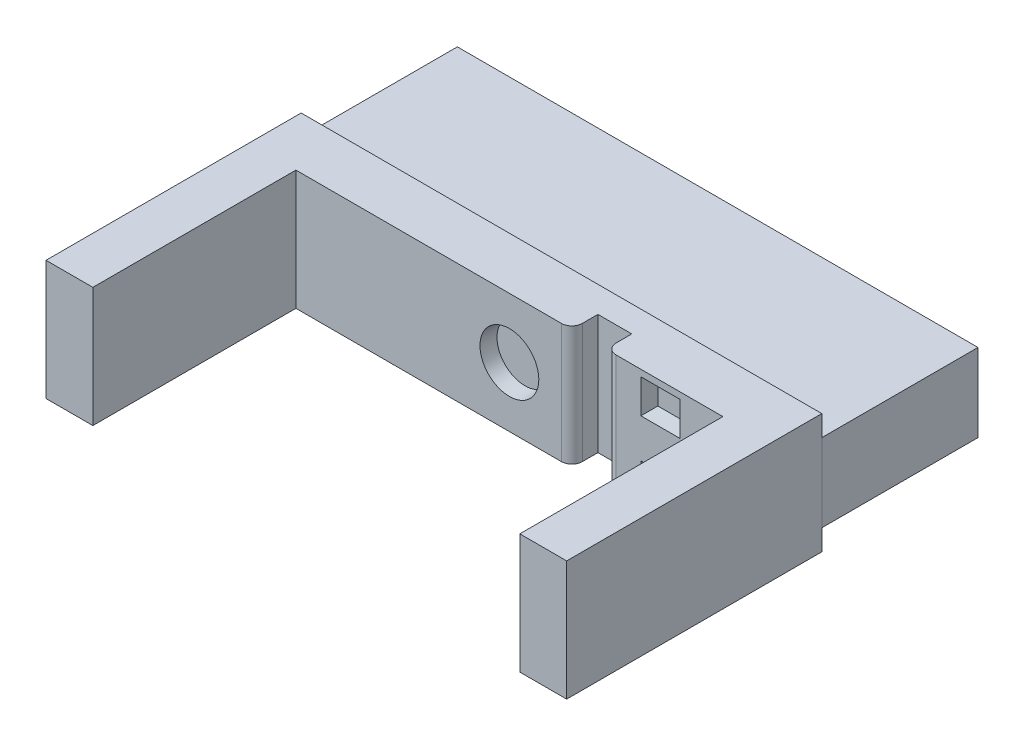
ISO-10303-21;
HEADER;
FILE_DESCRIPTION(('STEP AP214'),'2;1');
FILE_NAME('part.step','',(''),(''),'','','');
FILE_SCHEMA(('AUTOMOTIVE_DESIGN { 1 0 10303 214 1 1 1 1 }'));
ENDSEC;
DATA;
#1=APPLICATION_CONTEXT('core data for automotive mechanical design processes');
#2=APPLICATION_PROTOCOL_DEFINITION('international standard','automotive_design',2000,#1);
#3=PRODUCT_CONTEXT('',#1,'mechanical');
#4=PRODUCT('Part','Part','',(#3));
#5=PRODUCT_RELATED_PRODUCT_CATEGORY('part','',(#4));
#6=PRODUCT_DEFINITION_FORMATION('','',#4);
#7=PRODUCT_DEFINITION_CONTEXT('part definition',#1,'design');
#8=PRODUCT_DEFINITION('design','',#6,#7);
#9=PRODUCT_DEFINITION_SHAPE('','',#8);
#10=(LENGTH_UNIT() NAMED_UNIT(*) SI_UNIT(.MILLI.,.METRE.));
#11=(NAMED_UNIT(*) PLANE_ANGLE_UNIT() SI_UNIT($,.RADIAN.));
#12=(NAMED_UNIT(*) SI_UNIT($,.STERADIAN.) SOLID_ANGLE_UNIT());
#13=UNCERTAINTY_MEASURE_WITH_UNIT(LENGTH_MEASURE(1.E-05),#10,'distance_accuracy_value','');
#14=(GEOMETRIC_REPRESENTATION_CONTEXT(3) GLOBAL_UNCERTAINTY_ASSIGNED_CONTEXT((#13)) GLOBAL_UNIT_ASSIGNED_CONTEXT((#10,
#11,#12)) REPRESENTATION_CONTEXT('',''));
#15=CARTESIAN_POINT('',(0.,0.,0.));
#16=DIRECTION('',(0.,0.,1.));
#17=DIRECTION('',(1.,0.,0.));
#18=AXIS2_PLACEMENT_3D('',#15,#16,#17);
#19=CARTESIAN_POINT('',(0.,0.,40.));
#20=DIRECTION('',(0.,0.,1.));
#21=DIRECTION('',(1.,0.,0.));
#22=AXIS2_PLACEMENT_3D('',#19,#20,#21);
#23=PLANE('',#22);
#24=CARTESIAN_POINT('',(50.,-7.50000000000002,40.));
#25=DIRECTION('',(0.,0.,1.));
#26=DIRECTION('',(1.,0.,0.));
#27=AXIS2_PLACEMENT_3D('',#24,#25,#26);
#28=CIRCLE('',#27,5.64999999999999);
#29=CARTESIAN_POINT('',(55.65,-7.50000000000002,40.));
#30=VERTEX_POINT('',#29);
#31=EDGE_CURVE('E220',#30,#30,#28,.T.);
#32=ORIENTED_EDGE('',*,*,#31,.F.);
#33=EDGE_LOOP('',(#32));
#34=FACE_BOUND('',#33,.T.);
#35=DIRECTION('',(-1.,0.,0.));
#36=VECTOR('',#35,1.);
#37=CARTESIAN_POINT('',(100.,4.,40.));
#38=LINE('',#37,#36);
#39=CARTESIAN_POINT('',(60.,3.99999999999999,40.));
#40=VERTEX_POINT('',#39);
#41=CARTESIAN_POINT('',(9.00000000000001,3.99999999999999,40.));
#42=VERTEX_POINT('',#41);
#43=EDGE_CURVE('E331',#40,#42,#38,.T.);
#44=ORIENTED_EDGE('',*,*,#43,.T.);
#45=DIRECTION('',(0.,1.,0.));
#46=VECTOR('',#45,1.);
#47=CARTESIAN_POINT('',(9.,-19.,40.));
#48=LINE('',#47,#46);
#49=CARTESIAN_POINT('',(9.00000000000001,-19.,40.));
#50=VERTEX_POINT('',#49);
#51=EDGE_CURVE('E263',#50,#42,#48,.T.);
#52=ORIENTED_EDGE('',*,*,#51,.F.);
#53=DIRECTION('',(1.,0.,0.));
#54=VECTOR('',#53,1.);
#55=CARTESIAN_POINT('',(100.,-19.,40.));
#56=LINE('',#55,#54);
#57=CARTESIAN_POINT('',(60.,-19.,40.));
#58=VERTEX_POINT('',#57);
#59=EDGE_CURVE('E332',#50,#58,#56,.T.);
#60=ORIENTED_EDGE('',*,*,#59,.T.);
#61=DIRECTION('',(0.,-1.,0.));
#62=VECTOR('',#61,1.);
#63=CARTESIAN_POINT('',(60.,3.99999999999999,40.));
#64=LINE('',#63,#62);
#65=EDGE_CURVE('E362',#58,#40,#64,.F.);
#66=ORIENTED_EDGE('',*,*,#65,.T.);
#67=EDGE_LOOP('',(#44,#52,#60,#66));
#68=FACE_BOUND('',#67,.T.);
#69=ADVANCED_FACE('F42',(#34,#68),#23,.T.);
#70=DIRECTION('',(0.,-1.,0.));
#71=VECTOR('',#70,1.);
#72=CARTESIAN_POINT('',(75.25,-17.75,40.));
#73=LINE('',#72,#71);
#74=CARTESIAN_POINT('',(75.25,-11.25,40.));
#75=VERTEX_POINT('',#74);
#76=CARTESIAN_POINT('',(75.25,-17.75,40.));
#77=VERTEX_POINT('',#76);
#78=EDGE_CURVE('E57',#75,#77,#73,.T.);
#79=ORIENTED_EDGE('',*,*,#78,.F.);
#80=DIRECTION('',(-1.,0.,0.));
#81=VECTOR('',#80,1.);
#82=CARTESIAN_POINT('',(75.25,-11.25,40.));
#83=LINE('',#82,#81);
#84=CARTESIAN_POINT('',(82.75,-11.25,40.));
#85=VERTEX_POINT('',#84);
#86=EDGE_CURVE('E212',#85,#75,#83,.T.);
#87=ORIENTED_EDGE('',*,*,#86,.F.);
#88=DIRECTION('',(0.,1.,0.));
#89=VECTOR('',#88,1.);
#90=CARTESIAN_POINT('',(82.75,-17.75,40.));
#91=LINE('',#90,#89);
#92=CARTESIAN_POINT('',(82.75,-17.75,40.));
#93=VERTEX_POINT('',#92);
#94=EDGE_CURVE('E194',#93,#85,#91,.T.);
#95=ORIENTED_EDGE('',*,*,#94,.F.);
#96=DIRECTION('',(1.,0.,0.));
#97=VECTOR('',#96,1.);
#98=CARTESIAN_POINT('',(75.25,-17.75,40.));
#99=LINE('',#98,#97);
#100=EDGE_CURVE('E205',#77,#93,#99,.T.);
#101=ORIENTED_EDGE('',*,*,#100,.F.);
#102=EDGE_LOOP('',(#79,#87,#95,#101));
#103=FACE_BOUND('',#102,.T.);
#104=DIRECTION('',(0.,-1.,0.));
#105=VECTOR('',#104,1.);
#106=CARTESIAN_POINT('',(75.25,-3.75,40.));
#107=LINE('',#106,#105);
#108=CARTESIAN_POINT('',(75.25,2.75,40.));
#109=VERTEX_POINT('',#108);
#110=CARTESIAN_POINT('',(75.25,-3.75,40.));
#111=VERTEX_POINT('',#110);
#112=EDGE_CURVE('E65',#109,#111,#107,.T.);
#113=ORIENTED_EDGE('',*,*,#112,.F.);
#114=DIRECTION('',(-1.,0.,0.));
#115=VECTOR('',#114,1.);
#116=CARTESIAN_POINT('',(75.25,2.75,40.));
#117=LINE('',#116,#115);
#118=CARTESIAN_POINT('',(82.75,2.75,40.));
#119=VERTEX_POINT('',#118);
#120=EDGE_CURVE('E239',#119,#109,#117,.T.);
#121=ORIENTED_EDGE('',*,*,#120,.F.);
#122=DIRECTION('',(0.,1.,0.));
#123=VECTOR('',#122,1.);
#124=CARTESIAN_POINT('',(82.75,-3.75,40.));
#125=LINE('',#124,#123);
#126=CARTESIAN_POINT('',(82.75,-3.75,40.));
#127=VERTEX_POINT('',#126);
#128=EDGE_CURVE('E236',#127,#119,#125,.T.);
#129=ORIENTED_EDGE('',*,*,#128,.F.);
#130=DIRECTION('',(1.,0.,0.));
#131=VECTOR('',#130,1.);
#132=CARTESIAN_POINT('',(75.25,-3.75,40.));
#133=LINE('',#132,#131);
#134=EDGE_CURVE('E232',#111,#127,#133,.T.);
#135=ORIENTED_EDGE('',*,*,#134,.F.);
#136=EDGE_LOOP('',(#113,#121,#129,#135));
#137=FACE_BOUND('',#136,.T.);
#138=CARTESIAN_POINT('',(70.5,-19.,40.));
#139=VERTEX_POINT('',#138);
#140=CARTESIAN_POINT('',(91.,-19.,40.));
#141=VERTEX_POINT('',#140);
#142=EDGE_CURVE('E330',#139,#141,#56,.T.);
#143=ORIENTED_EDGE('',*,*,#142,.T.);
#144=DIRECTION('',(0.,-1.,0.));
#145=VECTOR('',#144,1.);
#146=CARTESIAN_POINT('',(91.,-19.,40.));
#147=LINE('',#146,#145);
#148=CARTESIAN_POINT('',(91.,4.,40.));
#149=VERTEX_POINT('',#148);
#150=EDGE_CURVE('E284',#149,#141,#147,.T.);
#151=ORIENTED_EDGE('',*,*,#150,.F.);
#152=CARTESIAN_POINT('',(70.5,3.99999999999999,40.));
#153=VERTEX_POINT('',#152);
#154=EDGE_CURVE('E328',#149,#153,#38,.T.);
#155=ORIENTED_EDGE('',*,*,#154,.T.);
#156=DIRECTION('',(0.,-1.,0.));
#157=VECTOR('',#156,1.);
#158=CARTESIAN_POINT('',(70.5,0.,40.));
#159=LINE('',#158,#157);
#160=EDGE_CURVE('E50',#153,#139,#159,.T.);
#161=ORIENTED_EDGE('',*,*,#160,.T.);
#162=EDGE_LOOP('',(#143,#151,#155,#161));
#163=FACE_BOUND('',#162,.T.);
#164=ADVANCED_FACE('F209',(#103,#137,#163),#23,.T.);
#165=CARTESIAN_POINT('',(100.,4.,40.));
#166=DIRECTION('',(0.,-1.,0.));
#167=DIRECTION('',(1.,0.,0.));
#168=AXIS2_PLACEMENT_3D('',#165,#166,#167);
#169=PLANE('',#168);
#170=ORIENTED_EDGE('',*,*,#43,.F.);
#171=CARTESIAN_POINT('',(60.,3.99999999999999,38.));
#172=DIRECTION('',(0.,-1.,0.));
#173=DIRECTION('',(1.,0.,0.));
#174=AXIS2_PLACEMENT_3D('',#171,#172,#173);
#175=CIRCLE('',#174,2.);
#176=CARTESIAN_POINT('',(62.,3.99999999999999,38.));
#177=VERTEX_POINT('',#176);
#178=EDGE_CURVE('E367',#40,#177,#175,.F.);
#179=ORIENTED_EDGE('',*,*,#178,.T.);
#180=DIRECTION('',(0.,0.,1.));
#181=VECTOR('',#180,1.);
#182=CARTESIAN_POINT('',(62.,3.99999999999999,35.));
#183=LINE('',#182,#181);
#184=CARTESIAN_POINT('',(62.,3.99999999999999,35.));
#185=VERTEX_POINT('',#184);
#186=EDGE_CURVE('E323',#185,#177,#183,.T.);
#187=ORIENTED_EDGE('',*,*,#186,.F.);
#188=DIRECTION('',(-1.,0.,0.));
#189=VECTOR('',#188,1.);
#190=CARTESIAN_POINT('',(0.,3.99999999999999,35.));
#191=LINE('',#190,#189);
#192=CARTESIAN_POINT('',(68.5,3.99999999999999,35.));
#193=VERTEX_POINT('',#192);
#194=EDGE_CURVE('E306',#193,#185,#191,.T.);
#195=ORIENTED_EDGE('',*,*,#194,.F.);
#196=DIRECTION('',(0.,0.,1.));
#197=VECTOR('',#196,1.);
#198=CARTESIAN_POINT('',(68.5,3.99999999999999,35.));
#199=LINE('',#198,#197);
#200=CARTESIAN_POINT('',(68.5,3.99999999999999,38.));
#201=VERTEX_POINT('',#200);
#202=EDGE_CURVE('E315',#193,#201,#199,.T.);
#203=ORIENTED_EDGE('',*,*,#202,.T.);
#204=CARTESIAN_POINT('',(70.5,3.99999999999999,38.));
#205=DIRECTION('',(0.,-1.,0.));
#206=DIRECTION('',(1.,0.,0.));
#207=AXIS2_PLACEMENT_3D('',#204,#205,#206);
#208=CIRCLE('',#207,2.);
#209=EDGE_CURVE('E364',#201,#153,#208,.F.);
#210=ORIENTED_EDGE('',*,*,#209,.T.);
#211=ORIENTED_EDGE('',*,*,#154,.F.);
#212=DIRECTION('',(0.,0.,-1.));
#213=VECTOR('',#212,1.);
#214=CARTESIAN_POINT('',(91.,4.,106.698178070457));
#215=LINE('',#214,#213);
#216=CARTESIAN_POINT('',(91.,4.,79.));
#217=VERTEX_POINT('',#216);
#218=EDGE_CURVE('E270',#217,#149,#215,.T.);
#219=ORIENTED_EDGE('',*,*,#218,.F.);
#220=DIRECTION('',(-1.,0.,0.));
#221=VECTOR('',#220,1.);
#222=CARTESIAN_POINT('',(100.,4.,79.));
#223=LINE('',#222,#221);
#224=CARTESIAN_POINT('',(100.,4.,79.));
#225=VERTEX_POINT('',#224);
#226=EDGE_CURVE('E292',#225,#217,#223,.T.);
#227=ORIENTED_EDGE('',*,*,#226,.F.);
#228=DIRECTION('',(0.,0.,-1.));
#229=VECTOR('',#228,1.);
#230=CARTESIAN_POINT('',(100.,4.,40.));
#231=LINE('',#230,#229);
#232=CARTESIAN_POINT('',(100.,4.,30.));
#233=VERTEX_POINT('',#232);
#234=EDGE_CURVE('E351',#225,#233,#231,.T.);
#235=ORIENTED_EDGE('',*,*,#234,.T.);
#236=DIRECTION('',(-1.,0.,0.));
#237=VECTOR('',#236,1.);
#238=CARTESIAN_POINT('',(100.,4.,30.));
#239=LINE('',#238,#237);
#240=CARTESIAN_POINT('',(0.,3.99999999999999,30.));
#241=VERTEX_POINT('',#240);
#242=EDGE_CURVE('E337',#233,#241,#239,.T.);
#243=ORIENTED_EDGE('',*,*,#242,.T.);
#244=DIRECTION('',(0.,0.,-1.));
#245=VECTOR('',#244,1.);
#246=CARTESIAN_POINT('',(0.,3.99999999999999,40.));
#247=LINE('',#246,#245);
#248=CARTESIAN_POINT('',(0.,3.99999999999999,79.));
#249=VERTEX_POINT('',#248);
#250=EDGE_CURVE('E348',#249,#241,#247,.T.);
#251=ORIENTED_EDGE('',*,*,#250,.F.);
#252=DIRECTION('',(-1.,0.,0.));
#253=VECTOR('',#252,1.);
#254=CARTESIAN_POINT('',(0.,3.99999999999999,79.));
#255=LINE('',#254,#253);
#256=CARTESIAN_POINT('',(9.,3.99999999999999,79.));
#257=VERTEX_POINT('',#256);
#258=EDGE_CURVE('E277',#257,#249,#255,.T.);
#259=ORIENTED_EDGE('',*,*,#258,.F.);
#260=DIRECTION('',(0.,0.,-1.));
#261=VECTOR('',#260,1.);
#262=CARTESIAN_POINT('',(9.,3.99999999999999,106.698178070457));
#263=LINE('',#262,#261);
#264=EDGE_CURVE('E266',#257,#42,#263,.T.);
#265=ORIENTED_EDGE('',*,*,#264,.T.);
#266=EDGE_LOOP('',(#170,#179,#187,#195,#203,#210,#211,#219,#227,#235,#243,#251,#259,#265));
#267=FACE_BOUND('',#266,.T.);
#268=ADVANCED_FACE('F384',(#267),#169,.F.);
#269=CARTESIAN_POINT('',(100.,-19.,40.));
#270=DIRECTION('',(0.,1.,0.));
#271=DIRECTION('',(-1.,0.,0.));
#272=AXIS2_PLACEMENT_3D('',#269,#270,#271);
#273=PLANE('',#272);
#274=DIRECTION('',(0.,0.,1.));
#275=VECTOR('',#274,1.);
#276=CARTESIAN_POINT('',(62.,-19.,35.));
#277=LINE('',#276,#275);
#278=CARTESIAN_POINT('',(62.,-19.,35.));
#279=VERTEX_POINT('',#278);
#280=CARTESIAN_POINT('',(62.,-19.,38.));
#281=VERTEX_POINT('',#280);
#282=EDGE_CURVE('E320',#279,#281,#277,.T.);
#283=ORIENTED_EDGE('',*,*,#282,.T.);
#284=CARTESIAN_POINT('',(60.,-19.,38.));
#285=DIRECTION('',(0.,1.,0.));
#286=DIRECTION('',(-1.,0.,0.));
#287=AXIS2_PLACEMENT_3D('',#284,#285,#286);
#288=CIRCLE('',#287,2.);
#289=EDGE_CURVE('E359',#281,#58,#288,.F.);
#290=ORIENTED_EDGE('',*,*,#289,.T.);
#291=ORIENTED_EDGE('',*,*,#59,.F.);
#292=DIRECTION('',(0.,0.,-1.));
#293=VECTOR('',#292,1.);
#294=CARTESIAN_POINT('',(9.,-19.,106.698178070457));
#295=LINE('',#294,#293);
#296=CARTESIAN_POINT('',(9.,-19.,79.));
#297=VERTEX_POINT('',#296);
#298=EDGE_CURVE('E245',#297,#50,#295,.T.);
#299=ORIENTED_EDGE('',*,*,#298,.F.);
#300=DIRECTION('',(1.,0.,0.));
#301=VECTOR('',#300,1.);
#302=CARTESIAN_POINT('',(0.,-19.,79.));
#303=LINE('',#302,#301);
#304=CARTESIAN_POINT('',(0.,-19.,79.));
#305=VERTEX_POINT('',#304);
#306=EDGE_CURVE('E271',#305,#297,#303,.T.);
#307=ORIENTED_EDGE('',*,*,#306,.F.);
#308=DIRECTION('',(0.,0.,-1.));
#309=VECTOR('',#308,1.);
#310=CARTESIAN_POINT('',(0.,-19.,40.));
#311=LINE('',#310,#309);
#312=CARTESIAN_POINT('',(0.,-19.,30.));
#313=VERTEX_POINT('',#312);
#314=EDGE_CURVE('E345',#305,#313,#311,.T.);
#315=ORIENTED_EDGE('',*,*,#314,.T.);
#316=DIRECTION('',(1.,0.,0.));
#317=VECTOR('',#316,1.);
#318=CARTESIAN_POINT('',(100.,-19.,30.));
#319=LINE('',#318,#317);
#320=CARTESIAN_POINT('',(100.,-19.,30.));
#321=VERTEX_POINT('',#320);
#322=EDGE_CURVE('E341',#313,#321,#319,.T.);
#323=ORIENTED_EDGE('',*,*,#322,.T.);
#324=DIRECTION('',(0.,0.,-1.));
#325=VECTOR('',#324,1.);
#326=CARTESIAN_POINT('',(100.,-19.,40.));
#327=LINE('',#326,#325);
#328=CARTESIAN_POINT('',(100.,-19.,79.));
#329=VERTEX_POINT('',#328);
#330=EDGE_CURVE('E334',#329,#321,#327,.T.);
#331=ORIENTED_EDGE('',*,*,#330,.F.);
#332=DIRECTION('',(1.,0.,0.));
#333=VECTOR('',#332,1.);
#334=CARTESIAN_POINT('',(100.,-19.,79.));
#335=LINE('',#334,#333);
#336=CARTESIAN_POINT('',(91.,-19.,79.));
#337=VERTEX_POINT('',#336);
#338=EDGE_CURVE('E298',#337,#329,#335,.T.);
#339=ORIENTED_EDGE('',*,*,#338,.F.);
#340=DIRECTION('',(0.,0.,-1.));
#341=VECTOR('',#340,1.);
#342=CARTESIAN_POINT('',(91.,-19.,106.698178070457));
#343=LINE('',#342,#341);
#344=EDGE_CURVE('E287',#337,#141,#343,.T.);
#345=ORIENTED_EDGE('',*,*,#344,.T.);
#346=ORIENTED_EDGE('',*,*,#142,.F.);
#347=CARTESIAN_POINT('',(70.5,-19.,38.));
#348=DIRECTION('',(0.,1.,0.));
#349=DIRECTION('',(-1.,0.,0.));
#350=AXIS2_PLACEMENT_3D('',#347,#348,#349);
#351=CIRCLE('',#350,2.);
#352=CARTESIAN_POINT('',(68.5,-19.,38.));
#353=VERTEX_POINT('',#352);
#354=EDGE_CURVE('E357',#139,#353,#351,.F.);
#355=ORIENTED_EDGE('',*,*,#354,.T.);
#356=DIRECTION('',(0.,0.,1.));
#357=VECTOR('',#356,1.);
#358=CARTESIAN_POINT('',(68.5,-19.,35.));
#359=LINE('',#358,#357);
#360=CARTESIAN_POINT('',(68.5,-19.,35.));
#361=VERTEX_POINT('',#360);
#362=EDGE_CURVE('E316',#361,#353,#359,.T.);
#363=ORIENTED_EDGE('',*,*,#362,.F.);
#364=DIRECTION('',(1.,0.,0.));
#365=VECTOR('',#364,1.);
#366=CARTESIAN_POINT('',(0.,-19.,35.));
#367=LINE('',#366,#365);
#368=EDGE_CURVE('E312',#279,#361,#367,.T.);
#369=ORIENTED_EDGE('',*,*,#368,.F.);
#370=EDGE_LOOP('',(#283,#290,#291,#299,#307,#315,#323,#331,#339,#345,#346,#355,#363,#369));
#371=FACE_BOUND('',#370,.T.);
#372=ADVANCED_FACE('F376',(#371),#273,.F.);
#373=CARTESIAN_POINT('',(100.,-19.,40.));
#374=DIRECTION('',(-1.,0.,0.));
#375=DIRECTION('',(0.,0.,1.));
#376=AXIS2_PLACEMENT_3D('',#373,#374,#375);
#377=PLANE('',#376);
#378=DIRECTION('',(0.,1.,0.));
#379=VECTOR('',#378,1.);
#380=CARTESIAN_POINT('',(100.,-19.,30.));
#381=LINE('',#380,#379);
#382=EDGE_CURVE('E319',#321,#233,#381,.T.);
#383=ORIENTED_EDGE('',*,*,#382,.T.);
#384=ORIENTED_EDGE('',*,*,#234,.F.);
#385=DIRECTION('',(0.,1.,0.));
#386=VECTOR('',#385,1.);
#387=CARTESIAN_POINT('',(100.,-19.,79.));
#388=LINE('',#387,#386);
#389=EDGE_CURVE('E295',#329,#225,#388,.T.);
#390=ORIENTED_EDGE('',*,*,#389,.F.);
#391=ORIENTED_EDGE('',*,*,#330,.T.);
#392=EDGE_LOOP('',(#383,#384,#390,#391));
#393=FACE_BOUND('',#392,.T.);
#394=ADVANCED_FACE('F419',(#393),#377,.F.);
#395=CARTESIAN_POINT('',(0.,-19.,40.));
#396=DIRECTION('',(1.,0.,0.));
#397=DIRECTION('',(0.,1.,0.));
#398=AXIS2_PLACEMENT_3D('',#395,#396,#397);
#399=PLANE('',#398);
#400=DIRECTION('',(0.,-1.,0.));
#401=VECTOR('',#400,1.);
#402=CARTESIAN_POINT('',(0.,-19.,30.));
#403=LINE('',#402,#401);
#404=EDGE_CURVE('E339',#241,#313,#403,.T.);
#405=ORIENTED_EDGE('',*,*,#404,.T.);
#406=ORIENTED_EDGE('',*,*,#314,.F.);
#407=DIRECTION('',(0.,-1.,0.));
#408=VECTOR('',#407,1.);
#409=CARTESIAN_POINT('',(0.,-19.,79.));
#410=LINE('',#409,#408);
#411=EDGE_CURVE('E274',#249,#305,#410,.T.);
#412=ORIENTED_EDGE('',*,*,#411,.F.);
#413=ORIENTED_EDGE('',*,*,#250,.T.);
#414=EDGE_LOOP('',(#405,#406,#412,#413));
#415=FACE_BOUND('',#414,.T.);
#416=ADVANCED_FACE('F423',(#415),#399,.F.);
#417=CARTESIAN_POINT('',(0.,0.,30.));
#418=DIRECTION('',(0.,0.,1.));
#419=DIRECTION('',(1.,0.,0.));
#420=AXIS2_PLACEMENT_3D('',#417,#418,#419);
#421=PLANE('',#420);
#422=ORIENTED_EDGE('',*,*,#382,.F.);
#423=ORIENTED_EDGE('',*,*,#322,.F.);
#424=ORIENTED_EDGE('',*,*,#404,.F.);
#425=ORIENTED_EDGE('',*,*,#242,.F.);
#426=EDGE_LOOP('',(#422,#423,#424,#425));
#427=FACE_BOUND('',#426,.T.);
#428=ADVANCED_FACE('F417',(#427),#421,.F.);
#429=CARTESIAN_POINT('',(68.5,0.,35.));
#430=DIRECTION('',(-1.,0.,0.));
#431=DIRECTION('',(0.,-1.,0.));
#432=AXIS2_PLACEMENT_3D('',#429,#430,#431);
#433=PLANE('',#432);
#434=ORIENTED_EDGE('',*,*,#362,.T.);
#435=DIRECTION('',(0.,-1.,0.));
#436=VECTOR('',#435,1.);
#437=CARTESIAN_POINT('',(68.5,0.,38.));
#438=LINE('',#437,#436);
#439=EDGE_CURVE('E12',#353,#201,#438,.F.);
#440=ORIENTED_EDGE('',*,*,#439,.T.);
#441=ORIENTED_EDGE('',*,*,#202,.F.);
#442=DIRECTION('',(0.,-1.,0.));
#443=VECTOR('',#442,1.);
#444=CARTESIAN_POINT('',(68.5,0.,35.));
#445=LINE('',#444,#443);
#446=EDGE_CURVE('E291',#193,#361,#445,.T.);
#447=ORIENTED_EDGE('',*,*,#446,.T.);
#448=EDGE_LOOP('',(#434,#440,#441,#447));
#449=FACE_BOUND('',#448,.T.);
#450=ADVANCED_FACE('F389',(#449),#433,.T.);
#451=CARTESIAN_POINT('',(62.,0.,35.));
#452=DIRECTION('',(-1.,0.,0.));
#453=DIRECTION('',(0.,0.,1.));
#454=AXIS2_PLACEMENT_3D('',#451,#452,#453);
#455=PLANE('',#454);
#456=ORIENTED_EDGE('',*,*,#186,.T.);
#457=DIRECTION('',(0.,-1.,0.));
#458=VECTOR('',#457,1.);
#459=CARTESIAN_POINT('',(62.,-19.,38.));
#460=LINE('',#459,#458);
#461=EDGE_CURVE('E354',#177,#281,#460,.T.);
#462=ORIENTED_EDGE('',*,*,#461,.T.);
#463=ORIENTED_EDGE('',*,*,#282,.F.);
#464=DIRECTION('',(0.,-1.,0.));
#465=VECTOR('',#464,1.);
#466=CARTESIAN_POINT('',(62.,0.,35.));
#467=LINE('',#466,#465);
#468=EDGE_CURVE('E309',#185,#279,#467,.T.);
#469=ORIENTED_EDGE('',*,*,#468,.F.);
#470=EDGE_LOOP('',(#456,#462,#463,#469));
#471=FACE_BOUND('',#470,.T.);
#472=ADVANCED_FACE('F396',(#471),#455,.F.);
#473=CARTESIAN_POINT('',(0.,0.,35.));
#474=DIRECTION('',(0.,0.,1.));
#475=DIRECTION('',(1.,0.,0.));
#476=AXIS2_PLACEMENT_3D('',#473,#474,#475);
#477=PLANE('',#476);
#478=ORIENTED_EDGE('',*,*,#446,.F.);
#479=ORIENTED_EDGE('',*,*,#194,.T.);
#480=ORIENTED_EDGE('',*,*,#468,.T.);
#481=ORIENTED_EDGE('',*,*,#368,.T.);
#482=EDGE_LOOP('',(#478,#479,#480,#481));
#483=FACE_BOUND('',#482,.T.);
#484=ADVANCED_FACE('F393',(#483),#477,.T.);
#485=CARTESIAN_POINT('',(60.,0.,38.));
#486=DIRECTION('',(0.,1.,0.));
#487=DIRECTION('',(0.,0.,1.));
#488=AXIS2_PLACEMENT_3D('',#485,#486,#487);
#489=CYLINDRICAL_SURFACE('',#488,2.);
#490=ORIENTED_EDGE('',*,*,#178,.F.);
#491=ORIENTED_EDGE('',*,*,#65,.F.);
#492=ORIENTED_EDGE('',*,*,#289,.F.);
#493=ORIENTED_EDGE('',*,*,#461,.F.);
#494=EDGE_LOOP('',(#490,#491,#492,#493));
#495=FACE_BOUND('',#494,.T.);
#496=ADVANCED_FACE('F400',(#495),#489,.T.);
#497=CARTESIAN_POINT('',(70.5,0.,38.));
#498=DIRECTION('',(0.,-1.,0.));
#499=DIRECTION('',(1.,0.,0.));
#500=AXIS2_PLACEMENT_3D('',#497,#498,#499);
#501=CYLINDRICAL_SURFACE('',#500,2.);
#502=ORIENTED_EDGE('',*,*,#209,.F.);
#503=ORIENTED_EDGE('',*,*,#439,.F.);
#504=ORIENTED_EDGE('',*,*,#354,.F.);
#505=ORIENTED_EDGE('',*,*,#160,.F.);
#506=EDGE_LOOP('',(#502,#503,#504,#505));
#507=FACE_BOUND('',#506,.T.);
#508=ADVANCED_FACE('F44',(#507),#501,.T.);
#509=CARTESIAN_POINT('',(91.,-19.,106.698178070457));
#510=DIRECTION('',(1.,0.,0.));
#511=DIRECTION('',(0.,0.,-1.));
#512=AXIS2_PLACEMENT_3D('',#509,#510,#511);
#513=PLANE('',#512);
#514=DIRECTION('',(0.,-1.,0.));
#515=VECTOR('',#514,1.);
#516=CARTESIAN_POINT('',(91.,-19.,79.));
#517=LINE('',#516,#515);
#518=EDGE_CURVE('E288',#217,#337,#517,.T.);
#519=ORIENTED_EDGE('',*,*,#518,.F.);
#520=ORIENTED_EDGE('',*,*,#218,.T.);
#521=ORIENTED_EDGE('',*,*,#150,.T.);
#522=ORIENTED_EDGE('',*,*,#344,.F.);
#523=EDGE_LOOP('',(#519,#520,#521,#522));
#524=FACE_BOUND('',#523,.T.);
#525=ADVANCED_FACE('F380',(#524),#513,.F.);
#526=CARTESIAN_POINT('',(49.9999999999998,-7.49999999999999,79.));
#527=DIRECTION('',(0.,0.,1.));
#528=DIRECTION('',(-0.166841632601668,-0.985983706574713,0.));
#529=AXIS2_PLACEMENT_3D('',#526,#527,#528);
#530=PLANE('',#529);
#531=ORIENTED_EDGE('',*,*,#338,.T.);
#532=ORIENTED_EDGE('',*,*,#389,.T.);
#533=ORIENTED_EDGE('',*,*,#226,.T.);
#534=ORIENTED_EDGE('',*,*,#518,.T.);
#535=EDGE_LOOP('',(#531,#532,#533,#534));
#536=FACE_BOUND('',#535,.T.);
#537=ADVANCED_FACE('F422',(#536),#530,.T.);
#538=CARTESIAN_POINT('',(9.,-19.,106.698178070457));
#539=DIRECTION('',(-1.,0.,0.));
#540=DIRECTION('',(0.,-1.,0.));
#541=AXIS2_PLACEMENT_3D('',#538,#539,#540);
#542=PLANE('',#541);
#543=DIRECTION('',(0.,1.,0.));
#544=VECTOR('',#543,1.);
#545=CARTESIAN_POINT('',(9.,-19.,79.));
#546=LINE('',#545,#544);
#547=EDGE_CURVE('E267',#297,#257,#546,.T.);
#548=ORIENTED_EDGE('',*,*,#547,.F.);
#549=ORIENTED_EDGE('',*,*,#298,.T.);
#550=ORIENTED_EDGE('',*,*,#51,.T.);
#551=ORIENTED_EDGE('',*,*,#264,.F.);
#552=EDGE_LOOP('',(#548,#549,#550,#551));
#553=FACE_BOUND('',#552,.T.);
#554=ADVANCED_FACE('F407',(#553),#542,.F.);
#555=CARTESIAN_POINT('',(49.9999999999998,-7.49999999999999,79.));
#556=DIRECTION('',(0.,0.,1.));
#557=DIRECTION('',(-0.166841632601668,-0.985983706574713,0.));
#558=AXIS2_PLACEMENT_3D('',#555,#556,#557);
#559=PLANE('',#558);
#560=ORIENTED_EDGE('',*,*,#258,.T.);
#561=ORIENTED_EDGE('',*,*,#411,.T.);
#562=ORIENTED_EDGE('',*,*,#306,.T.);
#563=ORIENTED_EDGE('',*,*,#547,.T.);
#564=EDGE_LOOP('',(#560,#561,#562,#563));
#565=FACE_BOUND('',#564,.T.);
#566=ADVANCED_FACE('F410',(#565),#559,.T.);
#567=CARTESIAN_POINT('',(75.25,-3.75,40.));
#568=DIRECTION('',(-0.996194698091746,0.,-0.0871557427476582));
#569=DIRECTION('',(-0.0871557427476582,0.,0.996194698091746));
#570=AXIS2_PLACEMENT_3D('',#567,#568,#569);
#571=PLANE('',#570);
#572=ORIENTED_EDGE('',*,*,#112,.T.);
#573=DIRECTION('',(-0.0868265938642476,-0.0868265938642476,0.992432509138967));
#574=VECTOR('',#573,1.);
#575=CARTESIAN_POINT('',(75.25,-3.75,40.));
#576=LINE('',#575,#574);
#577=CARTESIAN_POINT('',(75.5124659905778,-3.48753400942223,37.));
#578=VERTEX_POINT('',#577);
#579=EDGE_CURVE('E247',#578,#111,#576,.T.);
#580=ORIENTED_EDGE('',*,*,#579,.F.);
#581=DIRECTION('',(0.,-1.,0.));
#582=VECTOR('',#581,1.);
#583=CARTESIAN_POINT('',(75.5124659905778,-3.75,37.));
#584=LINE('',#583,#582);
#585=CARTESIAN_POINT('',(75.5124659905778,2.48753400942223,37.));
#586=VERTEX_POINT('',#585);
#587=EDGE_CURVE('E242',#586,#578,#584,.T.);
#588=ORIENTED_EDGE('',*,*,#587,.F.);
#589=DIRECTION('',(-0.0868265938642476,0.0868265938642476,0.992432509138967));
#590=VECTOR('',#589,1.);
#591=CARTESIAN_POINT('',(75.25,2.75,40.));
#592=LINE('',#591,#590);
#593=EDGE_CURVE('E243',#586,#109,#592,.T.);
#594=ORIENTED_EDGE('',*,*,#593,.T.);
#595=EDGE_LOOP('',(#572,#580,#588,#594));
#596=FACE_BOUND('',#595,.T.);
#597=ADVANCED_FACE('F465',(#596),#571,.F.);
#598=CARTESIAN_POINT('',(75.25,2.75,40.));
#599=DIRECTION('',(0.,0.996194698091746,-0.0871557427476582));
#600=DIRECTION('',(0.,0.0871557427476582,0.996194698091746));
#601=AXIS2_PLACEMENT_3D('',#598,#599,#600);
#602=PLANE('',#601);
#603=ORIENTED_EDGE('',*,*,#120,.T.);
#604=ORIENTED_EDGE('',*,*,#593,.F.);
#605=DIRECTION('',(-1.,0.,0.));
#606=VECTOR('',#605,1.);
#607=CARTESIAN_POINT('',(75.25,2.48753400942223,37.));
#608=LINE('',#607,#606);
#609=CARTESIAN_POINT('',(82.4875340094222,2.48753400942223,37.));
#610=VERTEX_POINT('',#609);
#611=EDGE_CURVE('E250',#610,#586,#608,.T.);
#612=ORIENTED_EDGE('',*,*,#611,.F.);
#613=DIRECTION('',(0.0868265938642476,0.0868265938642476,0.992432509138967));
#614=VECTOR('',#613,1.);
#615=CARTESIAN_POINT('',(82.7009974268866,2.70099742688657,39.4398980263435));
#616=LINE('',#615,#614);
#617=EDGE_CURVE('E246',#610,#119,#616,.T.);
#618=ORIENTED_EDGE('',*,*,#617,.T.);
#619=EDGE_LOOP('',(#603,#604,#612,#618));
#620=FACE_BOUND('',#619,.T.);
#621=ADVANCED_FACE('F468',(#620),#602,.F.);
#622=CARTESIAN_POINT('',(82.75,-3.75,40.));
#623=DIRECTION('',(0.996194698091746,0.,-0.0871557427476582));
#624=DIRECTION('',(-0.0871557427476582,0.,-0.996194698091746));
#625=AXIS2_PLACEMENT_3D('',#622,#623,#624);
#626=PLANE('',#625);
#627=ORIENTED_EDGE('',*,*,#128,.T.);
#628=ORIENTED_EDGE('',*,*,#617,.F.);
#629=DIRECTION('',(0.,1.,0.));
#630=VECTOR('',#629,1.);
#631=CARTESIAN_POINT('',(82.4875340094222,-3.75,37.));
#632=LINE('',#631,#630);
#633=CARTESIAN_POINT('',(82.4875340094222,-3.48753400942223,37.));
#634=VERTEX_POINT('',#633);
#635=EDGE_CURVE('E258',#634,#610,#632,.T.);
#636=ORIENTED_EDGE('',*,*,#635,.F.);
#637=DIRECTION('',(0.0868265938642476,-0.0868265938642476,0.992432509138967));
#638=VECTOR('',#637,1.);
#639=CARTESIAN_POINT('',(82.6934585694845,-3.6934585694845,39.3537284919349));
#640=LINE('',#639,#638);
#641=EDGE_CURVE('E249',#634,#127,#640,.T.);
#642=ORIENTED_EDGE('',*,*,#641,.T.);
#643=EDGE_LOOP('',(#627,#628,#636,#642));
#644=FACE_BOUND('',#643,.T.);
#645=ADVANCED_FACE('F471',(#644),#626,.F.);
#646=CARTESIAN_POINT('',(75.25,-3.75,40.));
#647=DIRECTION('',(0.,-0.996194698091746,-0.0871557427476582));
#648=DIRECTION('',(0.,0.0871557427476582,-0.996194698091746));
#649=AXIS2_PLACEMENT_3D('',#646,#647,#648);
#650=PLANE('',#649);
#651=ORIENTED_EDGE('',*,*,#134,.T.);
#652=ORIENTED_EDGE('',*,*,#641,.F.);
#653=DIRECTION('',(1.,0.,0.));
#654=VECTOR('',#653,1.);
#655=CARTESIAN_POINT('',(75.25,-3.48753400942223,37.));
#656=LINE('',#655,#654);
#657=EDGE_CURVE('E255',#578,#634,#656,.T.);
#658=ORIENTED_EDGE('',*,*,#657,.F.);
#659=ORIENTED_EDGE('',*,*,#579,.T.);
#660=EDGE_LOOP('',(#651,#652,#658,#659));
#661=FACE_BOUND('',#660,.T.);
#662=ADVANCED_FACE('F475',(#661),#650,.F.);
#663=CARTESIAN_POINT('',(0.,0.,37.));
#664=DIRECTION('',(0.,0.,-1.));
#665=DIRECTION('',(-1.,0.,0.));
#666=AXIS2_PLACEMENT_3D('',#663,#664,#665);
#667=PLANE('',#666);
#668=ORIENTED_EDGE('',*,*,#587,.T.);
#669=ORIENTED_EDGE('',*,*,#657,.T.);
#670=ORIENTED_EDGE('',*,*,#635,.T.);
#671=ORIENTED_EDGE('',*,*,#611,.T.);
#672=EDGE_LOOP('',(#668,#669,#670,#671));
#673=FACE_BOUND('',#672,.T.);
#674=ADVANCED_FACE('F479',(#673),#667,.F.);
#675=CARTESIAN_POINT('',(75.25,-17.75,40.));
#676=DIRECTION('',(-0.996194698091745,0.,-0.0871557427476582));
#677=DIRECTION('',(-0.0871557427476582,0.,0.996194698091746));
#678=AXIS2_PLACEMENT_3D('',#675,#676,#677);
#679=PLANE('',#678);
#680=ORIENTED_EDGE('',*,*,#78,.T.);
#681=DIRECTION('',(-0.0868265938642476,-0.0868265938642476,0.992432509138967));
#682=VECTOR('',#681,1.);
#683=CARTESIAN_POINT('',(75.25,-17.75,40.));
#684=LINE('',#683,#682);
#685=CARTESIAN_POINT('',(75.5124659905778,-17.4875340094222,37.));
#686=VERTEX_POINT('',#685);
#687=EDGE_CURVE('E202',#686,#77,#684,.T.);
#688=ORIENTED_EDGE('',*,*,#687,.F.);
#689=DIRECTION('',(0.,-1.,0.));
#690=VECTOR('',#689,1.);
#691=CARTESIAN_POINT('',(75.5124659905778,-17.75,37.));
#692=LINE('',#691,#690);
#693=CARTESIAN_POINT('',(75.5124659905778,-11.5124659905778,37.));
#694=VERTEX_POINT('',#693);
#695=EDGE_CURVE('E214',#694,#686,#692,.T.);
#696=ORIENTED_EDGE('',*,*,#695,.F.);
#697=DIRECTION('',(-0.0868265938642476,0.0868265938642476,0.992432509138967));
#698=VECTOR('',#697,1.);
#699=CARTESIAN_POINT('',(75.25,-11.25,40.));
#700=LINE('',#699,#698);
#701=EDGE_CURVE('E218',#694,#75,#700,.T.);
#702=ORIENTED_EDGE('',*,*,#701,.T.);
#703=EDGE_LOOP('',(#680,#688,#696,#702));
#704=FACE_BOUND('',#703,.T.);
#705=ADVANCED_FACE('F485',(#704),#679,.F.);
#706=CARTESIAN_POINT('',(75.25,-11.25,40.));
#707=DIRECTION('',(0.,0.996194698091746,-0.0871557427476582));
#708=DIRECTION('',(0.,0.0871557427476582,0.996194698091746));
#709=AXIS2_PLACEMENT_3D('',#706,#707,#708);
#710=PLANE('',#709);
#711=ORIENTED_EDGE('',*,*,#86,.T.);
#712=ORIENTED_EDGE('',*,*,#701,.F.);
#713=DIRECTION('',(-1.,0.,0.));
#714=VECTOR('',#713,1.);
#715=CARTESIAN_POINT('',(75.25,-11.5124659905778,37.));
#716=LINE('',#715,#714);
#717=CARTESIAN_POINT('',(82.4875340094222,-11.5124659905778,37.));
#718=VERTEX_POINT('',#717);
#719=EDGE_CURVE('E221',#718,#694,#716,.T.);
#720=ORIENTED_EDGE('',*,*,#719,.F.);
#721=DIRECTION('',(0.0868265938642476,0.0868265938642476,0.992432509138967));
#722=VECTOR('',#721,1.);
#723=CARTESIAN_POINT('',(82.7009974268866,-11.2990025731134,39.4398980263435));
#724=LINE('',#723,#722);
#725=EDGE_CURVE('E201',#718,#85,#724,.T.);
#726=ORIENTED_EDGE('',*,*,#725,.T.);
#727=EDGE_LOOP('',(#711,#712,#720,#726));
#728=FACE_BOUND('',#727,.T.);
#729=ADVANCED_FACE('F487',(#728),#710,.F.);
#730=CARTESIAN_POINT('',(82.75,-17.75,40.));
#731=DIRECTION('',(0.996194698091745,0.,-0.0871557427476582));
#732=DIRECTION('',(-0.0871557427476582,0.,-0.996194698091746));
#733=AXIS2_PLACEMENT_3D('',#730,#731,#732);
#734=PLANE('',#733);
#735=ORIENTED_EDGE('',*,*,#94,.T.);
#736=ORIENTED_EDGE('',*,*,#725,.F.);
#737=DIRECTION('',(0.,1.,0.));
#738=VECTOR('',#737,1.);
#739=CARTESIAN_POINT('',(82.4875340094222,-17.75,37.));
#740=LINE('',#739,#738);
#741=CARTESIAN_POINT('',(82.4875340094222,-17.4875340094222,37.));
#742=VERTEX_POINT('',#741);
#743=EDGE_CURVE('E197',#742,#718,#740,.T.);
#744=ORIENTED_EDGE('',*,*,#743,.F.);
#745=DIRECTION('',(0.0868265938642476,-0.0868265938642476,0.992432509138967));
#746=VECTOR('',#745,1.);
#747=CARTESIAN_POINT('',(82.6934585694845,-17.6934585694845,39.3537284919349));
#748=LINE('',#747,#746);
#749=EDGE_CURVE('E190',#742,#93,#748,.T.);
#750=ORIENTED_EDGE('',*,*,#749,.T.);
#751=EDGE_LOOP('',(#735,#736,#744,#750));
#752=FACE_BOUND('',#751,.T.);
#753=ADVANCED_FACE('F192',(#752),#734,.F.);
#754=CARTESIAN_POINT('',(75.25,-17.75,40.));
#755=DIRECTION('',(0.,-0.996194698091746,-0.0871557427476582));
#756=DIRECTION('',(0.,0.0871557427476582,-0.996194698091746));
#757=AXIS2_PLACEMENT_3D('',#754,#755,#756);
#758=PLANE('',#757);
#759=ORIENTED_EDGE('',*,*,#100,.T.);
#760=ORIENTED_EDGE('',*,*,#749,.F.);
#761=DIRECTION('',(1.,0.,0.));
#762=VECTOR('',#761,1.);
#763=CARTESIAN_POINT('',(75.25,-17.4875340094222,37.));
#764=LINE('',#763,#762);
#765=EDGE_CURVE('E226',#686,#742,#764,.T.);
#766=ORIENTED_EDGE('',*,*,#765,.F.);
#767=ORIENTED_EDGE('',*,*,#687,.T.);
#768=EDGE_LOOP('',(#759,#760,#766,#767));
#769=FACE_BOUND('',#768,.T.);
#770=ADVANCED_FACE('F206',(#769),#758,.F.);
#771=CARTESIAN_POINT('',(0.,0.,37.));
#772=DIRECTION('',(0.,0.,-1.));
#773=DIRECTION('',(-1.,0.,0.));
#774=AXIS2_PLACEMENT_3D('',#771,#772,#773);
#775=PLANE('',#774);
#776=ORIENTED_EDGE('',*,*,#695,.T.);
#777=ORIENTED_EDGE('',*,*,#765,.T.);
#778=ORIENTED_EDGE('',*,*,#743,.T.);
#779=ORIENTED_EDGE('',*,*,#719,.T.);
#780=EDGE_LOOP('',(#776,#777,#778,#779));
#781=FACE_BOUND('',#780,.T.);
#782=ADVANCED_FACE('F495',(#781),#775,.F.);
#783=CARTESIAN_POINT('',(50.,-7.50000000000002,40.));
#784=DIRECTION('',(0.,0.,1.));
#785=DIRECTION('',(1.,0.,0.));
#786=AXIS2_PLACEMENT_3D('',#783,#784,#785);
#787=CONICAL_SURFACE('',#786,5.64999999999999,0.0872664625997165);
#788=CARTESIAN_POINT('',(50.,-7.50000000000002,37.));
#789=DIRECTION('',(0.,0.,1.));
#790=DIRECTION('',(1.,0.,0.));
#791=AXIS2_PLACEMENT_3D('',#788,#789,#790);
#792=CIRCLE('',#791,5.38753400942221);
#793=CARTESIAN_POINT('',(55.3875340094222,-7.50000000000002,37.));
#794=VERTEX_POINT('',#793);
#795=EDGE_CURVE('E233',#794,#794,#792,.T.);
#796=ORIENTED_EDGE('',*,*,#795,.F.);
#797=EDGE_LOOP('',(#796));
#798=FACE_BOUND('',#797,.T.);
#799=ORIENTED_EDGE('',*,*,#31,.T.);
#800=EDGE_LOOP('',(#799));
#801=FACE_BOUND('',#800,.T.);
#802=ADVANCED_FACE('F500',(#798,#801),#787,.F.);
#803=CARTESIAN_POINT('',(50.,-7.50000000000002,37.));
#804=DIRECTION('',(0.,0.,1.));
#805=DIRECTION('',(1.,0.,0.));
#806=AXIS2_PLACEMENT_3D('',#803,#804,#805);
#807=PLANE('',#806);
#808=ORIENTED_EDGE('',*,*,#795,.T.);
#809=EDGE_LOOP('',(#808));
#810=FACE_BOUND('',#809,.T.);
#811=ADVANCED_FACE('F504',(#810),#807,.T.);
#812=CLOSED_SHELL('',(#69,#164,#268,#372,#394,#416,#428,#450,#472,#484,#496,#508,#525,#537,#554,
#566,#597,#621,#645,#662,#674,#705,#729,#753,#770,#782,#802,#811));
#813=MANIFOLD_SOLID_BREP('B2',#812);
#814=CARTESIAN_POINT('',(0.,0.,30.));
#815=DIRECTION('',(1.,0.,0.));
#816=DIRECTION('',(0.,1.,0.));
#817=AXIS2_PLACEMENT_3D('',#814,#815,#816);
#818=PLANE('',#817);
#819=DIRECTION('',(0.,-1.,0.));
#820=VECTOR('',#819,1.);
#821=CARTESIAN_POINT('',(0.,0.,0.));
#822=LINE('',#821,#820);
#823=CARTESIAN_POINT('',(0.,0.,0.));
#824=VERTEX_POINT('',#823);
#825=CARTESIAN_POINT('',(0.,-15.,0.));
#826=VERTEX_POINT('',#825);
#827=EDGE_CURVE('E766',#824,#826,#822,.T.);
#828=ORIENTED_EDGE('',*,*,#827,.T.);
#829=DIRECTION('',(0.,0.,-1.));
#830=VECTOR('',#829,1.);
#831=CARTESIAN_POINT('',(0.,-15.,30.));
#832=LINE('',#831,#830);
#833=CARTESIAN_POINT('',(0.,-15.,30.));
#834=VERTEX_POINT('',#833);
#835=EDGE_CURVE('E40',#834,#826,#832,.T.);
#836=ORIENTED_EDGE('',*,*,#835,.F.);
#837=DIRECTION('',(0.,-1.,0.));
#838=VECTOR('',#837,1.);
#839=CARTESIAN_POINT('',(0.,0.,30.));
#840=LINE('',#839,#838);
#841=CARTESIAN_POINT('',(0.,0.,30.));
#842=VERTEX_POINT('',#841);
#843=EDGE_CURVE('E754',#842,#834,#840,.T.);
#844=ORIENTED_EDGE('',*,*,#843,.F.);
#845=DIRECTION('',(0.,0.,-1.));
#846=VECTOR('',#845,1.);
#847=CARTESIAN_POINT('',(0.,0.,30.));
#848=LINE('',#847,#846);
#849=EDGE_CURVE('E762',#842,#824,#848,.T.);
#850=ORIENTED_EDGE('',*,*,#849,.T.);
#851=EDGE_LOOP('',(#828,#836,#844,#850));
#852=FACE_BOUND('',#851,.T.);
#853=ADVANCED_FACE('F703',(#852),#818,.F.);
#854=CARTESIAN_POINT('',(0.,-15.,30.));
#855=DIRECTION('',(0.,1.,0.));
#856=DIRECTION('',(0.,0.,1.));
#857=AXIS2_PLACEMENT_3D('',#854,#855,#856);
#858=PLANE('',#857);
#859=DIRECTION('',(1.,0.,0.));
#860=VECTOR('',#859,1.);
#861=CARTESIAN_POINT('',(0.,-15.,0.));
#862=LINE('',#861,#860);
#863=CARTESIAN_POINT('',(100.,-15.,0.));
#864=VERTEX_POINT('',#863);
#865=EDGE_CURVE('E758',#826,#864,#862,.T.);
#866=ORIENTED_EDGE('',*,*,#865,.T.);
#867=DIRECTION('',(0.,0.,-1.));
#868=VECTOR('',#867,1.);
#869=CARTESIAN_POINT('',(100.,-15.,30.));
#870=LINE('',#869,#868);
#871=CARTESIAN_POINT('',(100.,-15.,30.));
#872=VERTEX_POINT('',#871);
#873=EDGE_CURVE('E711',#872,#864,#870,.T.);
#874=ORIENTED_EDGE('',*,*,#873,.F.);
#875=DIRECTION('',(1.,0.,0.));
#876=VECTOR('',#875,1.);
#877=CARTESIAN_POINT('',(0.,-15.,30.));
#878=LINE('',#877,#876);
#879=EDGE_CURVE('E749',#834,#872,#878,.T.);
#880=ORIENTED_EDGE('',*,*,#879,.F.);
#881=ORIENTED_EDGE('',*,*,#835,.T.);
#882=EDGE_LOOP('',(#866,#874,#880,#881));
#883=FACE_BOUND('',#882,.T.);
#884=ADVANCED_FACE('F757',(#883),#858,.F.);
#885=CARTESIAN_POINT('',(100.,0.,30.));
#886=DIRECTION('',(-1.,0.,0.));
#887=DIRECTION('',(0.,0.,1.));
#888=AXIS2_PLACEMENT_3D('',#885,#886,#887);
#889=PLANE('',#888);
#890=DIRECTION('',(0.,1.,0.));
#891=VECTOR('',#890,1.);
#892=CARTESIAN_POINT('',(100.,0.,0.));
#893=LINE('',#892,#891);
#894=CARTESIAN_POINT('',(100.,0.,0.));
#895=VERTEX_POINT('',#894);
#896=EDGE_CURVE('E736',#864,#895,#893,.T.);
#897=ORIENTED_EDGE('',*,*,#896,.T.);
#898=DIRECTION('',(0.,0.,-1.));
#899=VECTOR('',#898,1.);
#900=CARTESIAN_POINT('',(100.,0.,30.));
#901=LINE('',#900,#899);
#902=CARTESIAN_POINT('',(100.,0.,30.));
#903=VERTEX_POINT('',#902);
#904=EDGE_CURVE('E759',#903,#895,#901,.T.);
#905=ORIENTED_EDGE('',*,*,#904,.F.);
#906=DIRECTION('',(0.,1.,0.));
#907=VECTOR('',#906,1.);
#908=CARTESIAN_POINT('',(100.,0.,30.));
#909=LINE('',#908,#907);
#910=EDGE_CURVE('E752',#872,#903,#909,.T.);
#911=ORIENTED_EDGE('',*,*,#910,.F.);
#912=ORIENTED_EDGE('',*,*,#873,.T.);
#913=EDGE_LOOP('',(#897,#905,#911,#912));
#914=FACE_BOUND('',#913,.T.);
#915=ADVANCED_FACE('F760',(#914),#889,.F.);
#916=CARTESIAN_POINT('',(0.,0.,30.));
#917=DIRECTION('',(0.,-1.,0.));
#918=DIRECTION('',(0.,0.,-1.));
#919=AXIS2_PLACEMENT_3D('',#916,#917,#918);
#920=PLANE('',#919);
#921=DIRECTION('',(-1.,0.,0.));
#922=VECTOR('',#921,1.);
#923=CARTESIAN_POINT('',(0.,0.,0.));
#924=LINE('',#923,#922);
#925=EDGE_CURVE('E742',#895,#824,#924,.T.);
#926=ORIENTED_EDGE('',*,*,#925,.T.);
#927=ORIENTED_EDGE('',*,*,#849,.F.);
#928=DIRECTION('',(-1.,0.,0.));
#929=VECTOR('',#928,1.);
#930=CARTESIAN_POINT('',(0.,0.,30.));
#931=LINE('',#930,#929);
#932=EDGE_CURVE('E719',#903,#842,#931,.T.);
#933=ORIENTED_EDGE('',*,*,#932,.F.);
#934=ORIENTED_EDGE('',*,*,#904,.T.);
#935=EDGE_LOOP('',(#926,#927,#933,#934));
#936=FACE_BOUND('',#935,.T.);
#937=ADVANCED_FACE('F773',(#936),#920,.F.);
#938=CARTESIAN_POINT('',(0.,0.,30.));
#939=DIRECTION('',(0.,0.,1.));
#940=DIRECTION('',(1.,0.,0.));
#941=AXIS2_PLACEMENT_3D('',#938,#939,#940);
#942=PLANE('',#941);
#943=ORIENTED_EDGE('',*,*,#843,.T.);
#944=ORIENTED_EDGE('',*,*,#879,.T.);
#945=ORIENTED_EDGE('',*,*,#910,.T.);
#946=ORIENTED_EDGE('',*,*,#932,.T.);
#947=EDGE_LOOP('',(#943,#944,#945,#946));
#948=FACE_BOUND('',#947,.T.);
#949=ADVANCED_FACE('F750',(#948),#942,.T.);
#950=CARTESIAN_POINT('',(0.,0.,0.));
#951=DIRECTION('',(0.,0.,1.));
#952=DIRECTION('',(1.,0.,0.));
#953=AXIS2_PLACEMENT_3D('',#950,#951,#952);
#954=PLANE('',#953);
#955=ORIENTED_EDGE('',*,*,#827,.F.);
#956=ORIENTED_EDGE('',*,*,#925,.F.);
#957=ORIENTED_EDGE('',*,*,#896,.F.);
#958=ORIENTED_EDGE('',*,*,#865,.F.);
#959=EDGE_LOOP('',(#955,#956,#957,#958));
#960=FACE_BOUND('',#959,.T.);
#961=ADVANCED_FACE('F776',(#960),#954,.F.);
#962=CLOSED_SHELL('',(#853,#884,#915,#937,#949,#961));
#963=MANIFOLD_SOLID_BREP('B6',#962);
#964=ADVANCED_BREP_SHAPE_REPRESENTATION('',(#18,#813,#963),#14);
#965=SHAPE_DEFINITION_REPRESENTATION(#9,#964);
ENDSEC;
END-ISO-10303-21;
